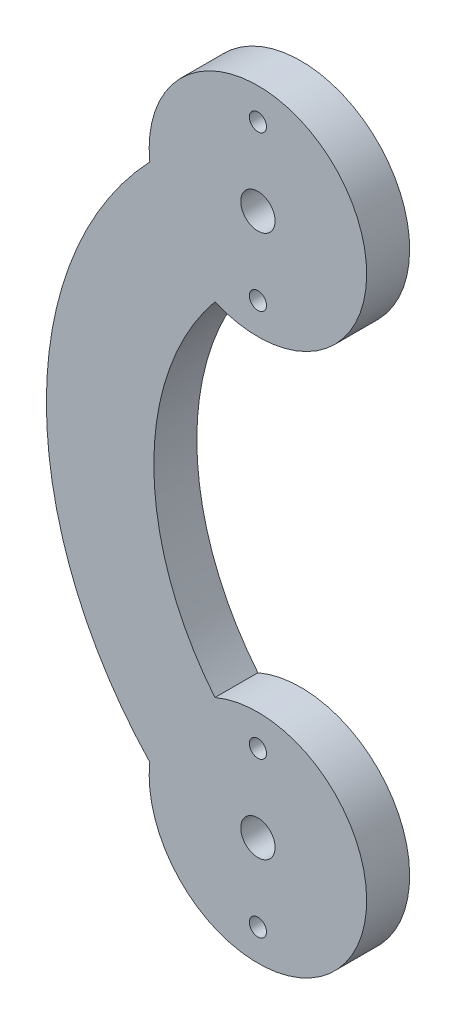
ISO-10303-21;
HEADER;
FILE_DESCRIPTION(('STEP AP214'),'2;1');
FILE_NAME('part.step','',(''),(''),'','','');
FILE_SCHEMA(('AUTOMOTIVE_DESIGN { 1 0 10303 214 1 1 1 1 }'));
ENDSEC;
DATA;
#1=APPLICATION_CONTEXT('core data for automotive mechanical design processes');
#2=APPLICATION_PROTOCOL_DEFINITION('international standard','automotive_design',2000,#1);
#3=PRODUCT_CONTEXT('',#1,'mechanical');
#4=PRODUCT('Part','Part','',(#3));
#5=PRODUCT_RELATED_PRODUCT_CATEGORY('part','',(#4));
#6=PRODUCT_DEFINITION_FORMATION('','',#4);
#7=PRODUCT_DEFINITION_CONTEXT('part definition',#1,'design');
#8=PRODUCT_DEFINITION('design','',#6,#7);
#9=PRODUCT_DEFINITION_SHAPE('','',#8);
#10=(LENGTH_UNIT() NAMED_UNIT(*) SI_UNIT(.MILLI.,.METRE.));
#11=(NAMED_UNIT(*) PLANE_ANGLE_UNIT() SI_UNIT($,.RADIAN.));
#12=(NAMED_UNIT(*) SI_UNIT($,.STERADIAN.) SOLID_ANGLE_UNIT());
#13=UNCERTAINTY_MEASURE_WITH_UNIT(LENGTH_MEASURE(1.E-05),#10,'distance_accuracy_value','');
#14=(GEOMETRIC_REPRESENTATION_CONTEXT(3) GLOBAL_UNCERTAINTY_ASSIGNED_CONTEXT((#13)) GLOBAL_UNIT_ASSIGNED_CONTEXT((#10,
#11,#12)) REPRESENTATION_CONTEXT('',''));
#15=CARTESIAN_POINT('',(0.,0.,0.));
#16=DIRECTION('',(0.,0.,1.));
#17=DIRECTION('',(1.,0.,0.));
#18=AXIS2_PLACEMENT_3D('',#15,#16,#17);
#19=CARTESIAN_POINT('',(29.4383100543796,22.5583423335873,5.));
#20=DIRECTION('',(0.,0.,1.));
#21=DIRECTION('',(1.,0.,0.));
#22=AXIS2_PLACEMENT_3D('',#19,#20,#21);
#23=PLANE('',#22);
#24=CARTESIAN_POINT('',(36.,54.1166846671747,5.));
#25=DIRECTION('',(0.,0.,1.));
#26=DIRECTION('',(1.,0.,0.));
#27=AXIS2_PLACEMENT_3D('',#24,#25,#26);
#28=CIRCLE('',#27,2.);
#29=CARTESIAN_POINT('',(38.,54.1166846671747,5.));
#30=VERTEX_POINT('',#29);
#31=EDGE_CURVE('E101',#30,#30,#28,.F.);
#32=ORIENTED_EDGE('',*,*,#31,.T.);
#33=EDGE_LOOP('',(#32));
#34=FACE_BOUND('',#33,.T.);
#35=CARTESIAN_POINT('',(36.,-9.00000000000001,5.));
#36=DIRECTION('',(0.,0.,1.));
#37=DIRECTION('',(1.,0.,0.));
#38=AXIS2_PLACEMENT_3D('',#35,#36,#37);
#39=CIRCLE('',#38,2.);
#40=CARTESIAN_POINT('',(38.,-9.00000000000001,5.));
#41=VERTEX_POINT('',#40);
#42=EDGE_CURVE('E104',#41,#41,#39,.F.);
#43=ORIENTED_EDGE('',*,*,#42,.T.);
#44=EDGE_LOOP('',(#43));
#45=FACE_BOUND('',#44,.T.);
#46=CARTESIAN_POINT('',(36.,63.1166846671747,5.));
#47=DIRECTION('',(0.,0.,-1.));
#48=DIRECTION('',(-1.,0.,0.));
#49=AXIS2_PLACEMENT_3D('',#46,#47,#48);
#50=CIRCLE('',#49,1.);
#51=CARTESIAN_POINT('',(35.,63.1166846671747,5.));
#52=VERTEX_POINT('',#51);
#53=EDGE_CURVE('E107',#52,#52,#50,.T.);
#54=ORIENTED_EDGE('',*,*,#53,.T.);
#55=EDGE_LOOP('',(#54));
#56=FACE_BOUND('',#55,.T.);
#57=CARTESIAN_POINT('',(36.,45.1166846671747,5.));
#58=DIRECTION('',(0.,0.,-1.));
#59=DIRECTION('',(-1.,0.,0.));
#60=AXIS2_PLACEMENT_3D('',#57,#58,#59);
#61=CIRCLE('',#60,1.);
#62=CARTESIAN_POINT('',(35.,45.1166846671747,5.));
#63=VERTEX_POINT('',#62);
#64=EDGE_CURVE('E110',#63,#63,#61,.T.);
#65=ORIENTED_EDGE('',*,*,#64,.T.);
#66=EDGE_LOOP('',(#65));
#67=FACE_BOUND('',#66,.T.);
#68=CARTESIAN_POINT('',(36.,0.,5.));
#69=DIRECTION('',(0.,0.,-1.));
#70=DIRECTION('',(-1.,0.,0.));
#71=AXIS2_PLACEMENT_3D('',#68,#69,#70);
#72=CIRCLE('',#71,1.);
#73=CARTESIAN_POINT('',(35.,0.,5.));
#74=VERTEX_POINT('',#73);
#75=EDGE_CURVE('E113',#74,#74,#72,.T.);
#76=ORIENTED_EDGE('',*,*,#75,.T.);
#77=EDGE_LOOP('',(#76));
#78=FACE_BOUND('',#77,.T.);
#79=CARTESIAN_POINT('',(36.,-18.,5.));
#80=DIRECTION('',(0.,0.,-1.));
#81=DIRECTION('',(-1.,0.,0.));
#82=AXIS2_PLACEMENT_3D('',#79,#80,#81);
#83=CIRCLE('',#82,1.);
#84=CARTESIAN_POINT('',(35.,-18.,5.));
#85=VERTEX_POINT('',#84);
#86=EDGE_CURVE('E116',#85,#85,#83,.T.);
#87=ORIENTED_EDGE('',*,*,#86,.T.);
#88=EDGE_LOOP('',(#87));
#89=FACE_BOUND('',#88,.T.);
#90=CARTESIAN_POINT('',(55.4041345078331,22.5583423335873,5.));
#91=DIRECTION('',(0.,0.,1.));
#92=DIRECTION('',(1.,0.,0.));
#93=AXIS2_PLACEMENT_3D('',#90,#91,#92);
#94=CIRCLE('',#93,44.0126737090413);
#95=CARTESIAN_POINT('',(23.4183829215579,-7.67453947545682,5.));
#96=VERTEX_POINT('',#95);
#97=CARTESIAN_POINT('',(23.4183829215579,52.7912241426315,5.));
#98=VERTEX_POINT('',#97);
#99=EDGE_CURVE('E20',#96,#98,#94,.F.);
#100=ORIENTED_EDGE('',*,*,#99,.F.);
#101=CARTESIAN_POINT('',(36.,-9.00000000000001,5.));
#102=DIRECTION('',(0.,0.,1.));
#103=DIRECTION('',(1.,0.,0.));
#104=AXIS2_PLACEMENT_3D('',#101,#102,#103);
#105=CIRCLE('',#104,12.6512423860532);
#106=CARTESIAN_POINT('',(31.,2.6212707528337,5.));
#107=VERTEX_POINT('',#106);
#108=EDGE_CURVE('E54',#107,#96,#105,.F.);
#109=ORIENTED_EDGE('',*,*,#108,.F.);
#110=CARTESIAN_POINT('',(55.4041345078331,22.5583423335873,5.));
#111=DIRECTION('',(0.,0.,1.));
#112=DIRECTION('',(1.,0.,0.));
#113=AXIS2_PLACEMENT_3D('',#110,#111,#112);
#114=CIRCLE('',#113,31.5126737090413);
#115=CARTESIAN_POINT('',(31.,42.495413914341,5.));
#116=VERTEX_POINT('',#115);
#117=EDGE_CURVE('E75',#107,#116,#114,.F.);
#118=ORIENTED_EDGE('',*,*,#117,.T.);
#119=CARTESIAN_POINT('',(36.,54.1166846671747,5.));
#120=DIRECTION('',(0.,0.,1.));
#121=DIRECTION('',(1.,0.,0.));
#122=AXIS2_PLACEMENT_3D('',#119,#120,#121);
#123=CIRCLE('',#122,12.6512423860532);
#124=EDGE_CURVE('E67',#98,#116,#123,.F.);
#125=ORIENTED_EDGE('',*,*,#124,.F.);
#126=EDGE_LOOP('',(#100,#109,#118,#125));
#127=FACE_BOUND('',#126,.T.);
#128=ADVANCED_FACE('F17',(#34,#45,#56,#67,#78,#89,#127),#23,.T.);
#129=CARTESIAN_POINT('',(55.4041345078331,22.5583423335873,0.));
#130=DIRECTION('',(0.,0.,1.));
#131=DIRECTION('',(1.,0.,0.));
#132=AXIS2_PLACEMENT_3D('',#129,#130,#131);
#133=CYLINDRICAL_SURFACE('',#132,44.0126737090413);
#134=CARTESIAN_POINT('',(55.4041345078331,22.5583423335873,0.));
#135=DIRECTION('',(0.,0.,1.));
#136=DIRECTION('',(1.,0.,0.));
#137=AXIS2_PLACEMENT_3D('',#134,#135,#136);
#138=CIRCLE('',#137,44.0126737090413);
#139=CARTESIAN_POINT('',(23.4183829215579,52.7912241426315,0.));
#140=VERTEX_POINT('',#139);
#141=CARTESIAN_POINT('',(23.4183829215579,-7.67453947545682,0.));
#142=VERTEX_POINT('',#141);
#143=EDGE_CURVE('E73',#140,#142,#138,.T.);
#144=ORIENTED_EDGE('',*,*,#143,.T.);
#145=DIRECTION('',(0.,0.,1.));
#146=VECTOR('',#145,1.);
#147=CARTESIAN_POINT('',(23.4183829215579,-7.67453947545682,0.));
#148=LINE('',#147,#146);
#149=EDGE_CURVE('E59',#96,#142,#148,.F.);
#150=ORIENTED_EDGE('',*,*,#149,.F.);
#151=ORIENTED_EDGE('',*,*,#99,.T.);
#152=DIRECTION('',(0.,0.,1.));
#153=VECTOR('',#152,1.);
#154=CARTESIAN_POINT('',(23.4183829215579,52.7912241426315,0.));
#155=LINE('',#154,#153);
#156=EDGE_CURVE('E119',#140,#98,#155,.T.);
#157=ORIENTED_EDGE('',*,*,#156,.F.);
#158=EDGE_LOOP('',(#144,#150,#151,#157));
#159=FACE_BOUND('',#158,.T.);
#160=ADVANCED_FACE('F72',(#159),#133,.T.);
#161=CARTESIAN_POINT('',(36.,-9.00000000000001,0.));
#162=DIRECTION('',(0.,0.,1.));
#163=DIRECTION('',(1.,0.,0.));
#164=AXIS2_PLACEMENT_3D('',#161,#162,#163);
#165=CYLINDRICAL_SURFACE('',#164,12.6512423860532);
#166=CARTESIAN_POINT('',(36.,-9.00000000000001,0.));
#167=DIRECTION('',(0.,0.,1.));
#168=DIRECTION('',(1.,0.,0.));
#169=AXIS2_PLACEMENT_3D('',#166,#167,#168);
#170=CIRCLE('',#169,12.6512423860532);
#171=CARTESIAN_POINT('',(31.,2.6212707528337,0.));
#172=VERTEX_POINT('',#171);
#173=EDGE_CURVE('E98',#142,#172,#170,.T.);
#174=ORIENTED_EDGE('',*,*,#173,.T.);
#175=DIRECTION('',(0.,0.,1.));
#176=VECTOR('',#175,1.);
#177=CARTESIAN_POINT('',(31.,2.6212707528337,0.));
#178=LINE('',#177,#176);
#179=EDGE_CURVE('E61',#172,#107,#178,.T.);
#180=ORIENTED_EDGE('',*,*,#179,.T.);
#181=ORIENTED_EDGE('',*,*,#108,.T.);
#182=ORIENTED_EDGE('',*,*,#149,.T.);
#183=EDGE_LOOP('',(#174,#180,#181,#182));
#184=FACE_BOUND('',#183,.T.);
#185=ADVANCED_FACE('F57',(#184),#165,.T.);
#186=CARTESIAN_POINT('',(55.4041345078331,22.5583423335873,0.));
#187=DIRECTION('',(0.,0.,1.));
#188=DIRECTION('',(1.,0.,0.));
#189=AXIS2_PLACEMENT_3D('',#186,#187,#188);
#190=CYLINDRICAL_SURFACE('',#189,31.5126737090413);
#191=ORIENTED_EDGE('',*,*,#179,.F.);
#192=CARTESIAN_POINT('',(55.4041345078331,22.5583423335873,0.));
#193=DIRECTION('',(0.,0.,1.));
#194=DIRECTION('',(1.,0.,0.));
#195=AXIS2_PLACEMENT_3D('',#192,#193,#194);
#196=CIRCLE('',#195,31.5126737090413);
#197=CARTESIAN_POINT('',(31.,42.495413914341,0.));
#198=VERTEX_POINT('',#197);
#199=EDGE_CURVE('E95',#172,#198,#196,.F.);
#200=ORIENTED_EDGE('',*,*,#199,.T.);
#201=DIRECTION('',(0.,0.,1.));
#202=VECTOR('',#201,1.);
#203=CARTESIAN_POINT('',(31.,42.495413914341,0.));
#204=LINE('',#203,#202);
#205=EDGE_CURVE('E35',#116,#198,#204,.F.);
#206=ORIENTED_EDGE('',*,*,#205,.F.);
#207=ORIENTED_EDGE('',*,*,#117,.F.);
#208=EDGE_LOOP('',(#191,#200,#206,#207));
#209=FACE_BOUND('',#208,.T.);
#210=ADVANCED_FACE('F122',(#209),#190,.F.);
#211=CARTESIAN_POINT('',(36.,54.1166846671747,0.));
#212=DIRECTION('',(0.,0.,1.));
#213=DIRECTION('',(1.,0.,0.));
#214=AXIS2_PLACEMENT_3D('',#211,#212,#213);
#215=CYLINDRICAL_SURFACE('',#214,12.6512423860532);
#216=CARTESIAN_POINT('',(36.,54.1166846671747,0.));
#217=DIRECTION('',(0.,0.,1.));
#218=DIRECTION('',(1.,0.,0.));
#219=AXIS2_PLACEMENT_3D('',#216,#217,#218);
#220=CIRCLE('',#219,12.6512423860532);
#221=EDGE_CURVE('E93',#198,#140,#220,.T.);
#222=ORIENTED_EDGE('',*,*,#221,.T.);
#223=ORIENTED_EDGE('',*,*,#156,.T.);
#224=ORIENTED_EDGE('',*,*,#124,.T.);
#225=ORIENTED_EDGE('',*,*,#205,.T.);
#226=EDGE_LOOP('',(#222,#223,#224,#225));
#227=FACE_BOUND('',#226,.T.);
#228=ADVANCED_FACE('F125',(#227),#215,.T.);
#229=CARTESIAN_POINT('',(36.,-18.,5.));
#230=DIRECTION('',(0.,0.,-1.));
#231=DIRECTION('',(-1.,0.,0.));
#232=AXIS2_PLACEMENT_3D('',#229,#230,#231);
#233=CYLINDRICAL_SURFACE('',#232,1.);
#234=ORIENTED_EDGE('',*,*,#86,.F.);
#235=EDGE_LOOP('',(#234));
#236=FACE_BOUND('',#235,.T.);
#237=CARTESIAN_POINT('',(36.,-18.,0.));
#238=DIRECTION('',(0.,0.,-1.));
#239=DIRECTION('',(-1.,0.,0.));
#240=AXIS2_PLACEMENT_3D('',#237,#238,#239);
#241=CIRCLE('',#240,1.);
#242=CARTESIAN_POINT('',(35.,-18.,0.));
#243=VERTEX_POINT('',#242);
#244=EDGE_CURVE('E90',#243,#243,#241,.T.);
#245=ORIENTED_EDGE('',*,*,#244,.T.);
#246=EDGE_LOOP('',(#245));
#247=FACE_BOUND('',#246,.T.);
#248=ADVANCED_FACE('F156',(#236,#247),#233,.F.);
#249=CARTESIAN_POINT('',(36.,0.,5.));
#250=DIRECTION('',(0.,0.,-1.));
#251=DIRECTION('',(-1.,0.,0.));
#252=AXIS2_PLACEMENT_3D('',#249,#250,#251);
#253=CYLINDRICAL_SURFACE('',#252,1.);
#254=ORIENTED_EDGE('',*,*,#75,.F.);
#255=EDGE_LOOP('',(#254));
#256=FACE_BOUND('',#255,.T.);
#257=CARTESIAN_POINT('',(36.,0.,0.));
#258=DIRECTION('',(0.,0.,-1.));
#259=DIRECTION('',(-1.,0.,0.));
#260=AXIS2_PLACEMENT_3D('',#257,#258,#259);
#261=CIRCLE('',#260,1.);
#262=CARTESIAN_POINT('',(35.,0.,0.));
#263=VERTEX_POINT('',#262);
#264=EDGE_CURVE('E87',#263,#263,#261,.T.);
#265=ORIENTED_EDGE('',*,*,#264,.T.);
#266=EDGE_LOOP('',(#265));
#267=FACE_BOUND('',#266,.T.);
#268=ADVANCED_FACE('F152',(#256,#267),#253,.F.);
#269=CARTESIAN_POINT('',(36.,45.1166846671747,5.));
#270=DIRECTION('',(0.,0.,-1.));
#271=DIRECTION('',(-1.,0.,0.));
#272=AXIS2_PLACEMENT_3D('',#269,#270,#271);
#273=CYLINDRICAL_SURFACE('',#272,1.);
#274=ORIENTED_EDGE('',*,*,#64,.F.);
#275=EDGE_LOOP('',(#274));
#276=FACE_BOUND('',#275,.T.);
#277=CARTESIAN_POINT('',(36.,45.1166846671747,0.));
#278=DIRECTION('',(0.,0.,-1.));
#279=DIRECTION('',(-1.,0.,0.));
#280=AXIS2_PLACEMENT_3D('',#277,#278,#279);
#281=CIRCLE('',#280,1.);
#282=CARTESIAN_POINT('',(35.,45.1166846671747,0.));
#283=VERTEX_POINT('',#282);
#284=EDGE_CURVE('E84',#283,#283,#281,.T.);
#285=ORIENTED_EDGE('',*,*,#284,.T.);
#286=EDGE_LOOP('',(#285));
#287=FACE_BOUND('',#286,.T.);
#288=ADVANCED_FACE('F148',(#276,#287),#273,.F.);
#289=CARTESIAN_POINT('',(36.,63.1166846671747,5.));
#290=DIRECTION('',(0.,0.,-1.));
#291=DIRECTION('',(-1.,0.,0.));
#292=AXIS2_PLACEMENT_3D('',#289,#290,#291);
#293=CYLINDRICAL_SURFACE('',#292,1.);
#294=ORIENTED_EDGE('',*,*,#53,.F.);
#295=EDGE_LOOP('',(#294));
#296=FACE_BOUND('',#295,.T.);
#297=CARTESIAN_POINT('',(36.,63.1166846671747,0.));
#298=DIRECTION('',(0.,0.,-1.));
#299=DIRECTION('',(-1.,0.,0.));
#300=AXIS2_PLACEMENT_3D('',#297,#298,#299);
#301=CIRCLE('',#300,1.);
#302=CARTESIAN_POINT('',(35.,63.1166846671747,0.));
#303=VERTEX_POINT('',#302);
#304=EDGE_CURVE('E81',#303,#303,#301,.T.);
#305=ORIENTED_EDGE('',*,*,#304,.T.);
#306=EDGE_LOOP('',(#305));
#307=FACE_BOUND('',#306,.T.);
#308=ADVANCED_FACE('F144',(#296,#307),#293,.F.);
#309=CARTESIAN_POINT('',(36.,-9.00000000000001,0.));
#310=DIRECTION('',(0.,0.,1.));
#311=DIRECTION('',(1.,0.,0.));
#312=AXIS2_PLACEMENT_3D('',#309,#310,#311);
#313=CYLINDRICAL_SURFACE('',#312,2.);
#314=CARTESIAN_POINT('',(36.,-9.00000000000001,0.));
#315=DIRECTION('',(0.,0.,1.));
#316=DIRECTION('',(1.,0.,0.));
#317=AXIS2_PLACEMENT_3D('',#314,#315,#316);
#318=CIRCLE('',#317,2.);
#319=CARTESIAN_POINT('',(38.,-9.00000000000001,0.));
#320=VERTEX_POINT('',#319);
#321=EDGE_CURVE('E26',#320,#320,#318,.F.);
#322=ORIENTED_EDGE('',*,*,#321,.T.);
#323=EDGE_LOOP('',(#322));
#324=FACE_BOUND('',#323,.T.);
#325=ORIENTED_EDGE('',*,*,#42,.F.);
#326=EDGE_LOOP('',(#325));
#327=FACE_BOUND('',#326,.T.);
#328=ADVANCED_FACE('F136',(#324,#327),#313,.F.);
#329=CARTESIAN_POINT('',(36.,54.1166846671747,0.));
#330=DIRECTION('',(0.,0.,1.));
#331=DIRECTION('',(1.,0.,0.));
#332=AXIS2_PLACEMENT_3D('',#329,#330,#331);
#333=CYLINDRICAL_SURFACE('',#332,2.);
#334=CARTESIAN_POINT('',(36.,54.1166846671747,0.));
#335=DIRECTION('',(0.,0.,1.));
#336=DIRECTION('',(1.,0.,0.));
#337=AXIS2_PLACEMENT_3D('',#334,#335,#336);
#338=CIRCLE('',#337,2.);
#339=CARTESIAN_POINT('',(38.,54.1166846671747,0.));
#340=VERTEX_POINT('',#339);
#341=EDGE_CURVE('E11',#340,#340,#338,.F.);
#342=ORIENTED_EDGE('',*,*,#341,.T.);
#343=EDGE_LOOP('',(#342));
#344=FACE_BOUND('',#343,.T.);
#345=ORIENTED_EDGE('',*,*,#31,.F.);
#346=EDGE_LOOP('',(#345));
#347=FACE_BOUND('',#346,.T.);
#348=ADVANCED_FACE('F129',(#344,#347),#333,.F.);
#349=CARTESIAN_POINT('',(29.4383100543796,22.5583423335873,0.));
#350=DIRECTION('',(0.,0.,1.));
#351=DIRECTION('',(1.,0.,0.));
#352=AXIS2_PLACEMENT_3D('',#349,#350,#351);
#353=PLANE('',#352);
#354=ORIENTED_EDGE('',*,*,#341,.F.);
#355=EDGE_LOOP('',(#354));
#356=FACE_BOUND('',#355,.T.);
#357=ORIENTED_EDGE('',*,*,#321,.F.);
#358=EDGE_LOOP('',(#357));
#359=FACE_BOUND('',#358,.T.);
#360=ORIENTED_EDGE('',*,*,#304,.F.);
#361=EDGE_LOOP('',(#360));
#362=FACE_BOUND('',#361,.T.);
#363=ORIENTED_EDGE('',*,*,#284,.F.);
#364=EDGE_LOOP('',(#363));
#365=FACE_BOUND('',#364,.T.);
#366=ORIENTED_EDGE('',*,*,#264,.F.);
#367=EDGE_LOOP('',(#366));
#368=FACE_BOUND('',#367,.T.);
#369=ORIENTED_EDGE('',*,*,#244,.F.);
#370=EDGE_LOOP('',(#369));
#371=FACE_BOUND('',#370,.T.);
#372=ORIENTED_EDGE('',*,*,#199,.F.);
#373=ORIENTED_EDGE('',*,*,#173,.F.);
#374=ORIENTED_EDGE('',*,*,#143,.F.);
#375=ORIENTED_EDGE('',*,*,#221,.F.);
#376=EDGE_LOOP('',(#372,#373,#374,#375));
#377=FACE_BOUND('',#376,.T.);
#378=ADVANCED_FACE('F127',(#356,#359,#362,#365,#368,#371,#377),#353,.F.);
#379=CLOSED_SHELL('',(#128,#160,#185,#210,#228,#248,#268,#288,#308,#328,#348,#378));
#380=MANIFOLD_SOLID_BREP('B1',#379);
#381=ADVANCED_BREP_SHAPE_REPRESENTATION('',(#18,#380),#14);
#382=SHAPE_DEFINITION_REPRESENTATION(#9,#381);
ENDSEC;
END-ISO-10303-21;
